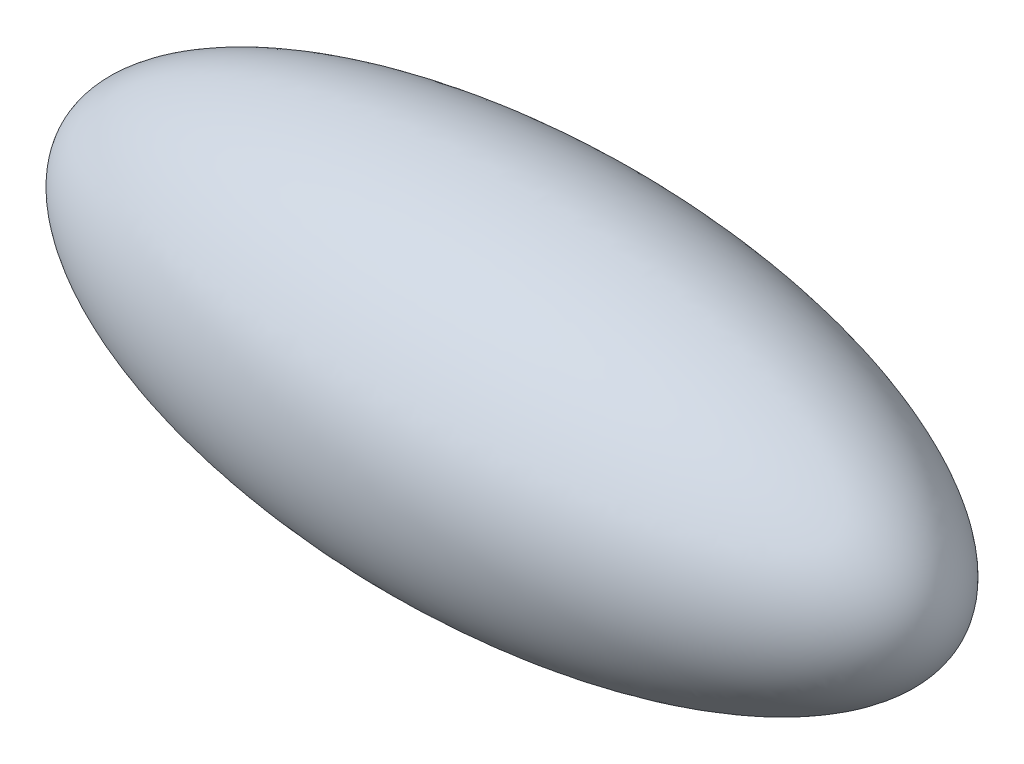
ISO-10303-21;
HEADER;
FILE_DESCRIPTION(('STEP AP214'),'2;1');
FILE_NAME('part.step','',(''),(''),'','','');
FILE_SCHEMA(('AUTOMOTIVE_DESIGN { 1 0 10303 214 1 1 1 1 }'));
ENDSEC;
DATA;
#1=APPLICATION_CONTEXT('core data for automotive mechanical design processes');
#2=APPLICATION_PROTOCOL_DEFINITION('international standard','automotive_design',2000,#1);
#3=PRODUCT_CONTEXT('',#1,'mechanical');
#4=PRODUCT('Part','Part','',(#3));
#5=PRODUCT_RELATED_PRODUCT_CATEGORY('part','',(#4));
#6=PRODUCT_DEFINITION_FORMATION('','',#4);
#7=PRODUCT_DEFINITION_CONTEXT('part definition',#1,'design');
#8=PRODUCT_DEFINITION('design','',#6,#7);
#9=PRODUCT_DEFINITION_SHAPE('','',#8);
#10=(LENGTH_UNIT() NAMED_UNIT(*) SI_UNIT(.MILLI.,.METRE.));
#11=(NAMED_UNIT(*) PLANE_ANGLE_UNIT() SI_UNIT($,.RADIAN.));
#12=(NAMED_UNIT(*) SI_UNIT($,.STERADIAN.) SOLID_ANGLE_UNIT());
#13=UNCERTAINTY_MEASURE_WITH_UNIT(LENGTH_MEASURE(1.E-05),#10,'distance_accuracy_value','');
#14=(GEOMETRIC_REPRESENTATION_CONTEXT(3) GLOBAL_UNCERTAINTY_ASSIGNED_CONTEXT((#13)) GLOBAL_UNIT_ASSIGNED_CONTEXT((#10,
#11,#12)) REPRESENTATION_CONTEXT('',''));
#15=CARTESIAN_POINT('',(0.,0.,0.));
#16=DIRECTION('',(0.,0.,1.));
#17=DIRECTION('',(1.,0.,0.));
#18=AXIS2_PLACEMENT_3D('',#15,#16,#17);
#19=CARTESIAN_POINT('',(0.,0.,0.));
#20=DIRECTION('',(0.,1.,0.));
#21=DIRECTION('',(-1.,0.,0.));
#22=AXIS2_PLACEMENT_3D('',#19,#20,#21);
#23=ELLIPSE('',#22,0.5,0.199999999999999);
#24=TRIMMED_CURVE('',#23,(PARAMETER_VALUE(0.)),(PARAMETER_VALUE(3.14159265358979)),.T.,.PARAMETER.);
#25=CARTESIAN_POINT('',(-0.5,0.,0.));
#26=DIRECTION('',(-1.,0.,0.));
#27=AXIS1_PLACEMENT('',#25,#26);
#28=SURFACE_OF_REVOLUTION('',#24,#27);
#29=CARTESIAN_POINT('',(0.5,0.,0.));
#30=VERTEX_POINT('',#29);
#31=VERTEX_LOOP('',#30);
#32=FACE_BOUND('',#31,.T.);
#33=CARTESIAN_POINT('',(-0.5,0.,0.));
#34=VERTEX_POINT('',#33);
#35=VERTEX_LOOP('',#34);
#36=FACE_BOUND('',#35,.T.);
#37=ADVANCED_FACE('F32',(#32,#36),#28,.F.);
#38=CLOSED_SHELL('',(#37));
#39=MANIFOLD_SOLID_BREP('B2',#38);
#40=ADVANCED_BREP_SHAPE_REPRESENTATION('',(#18,#39),#14);
#41=SHAPE_DEFINITION_REPRESENTATION(#9,#40);
ENDSEC;
END-ISO-10303-21;
